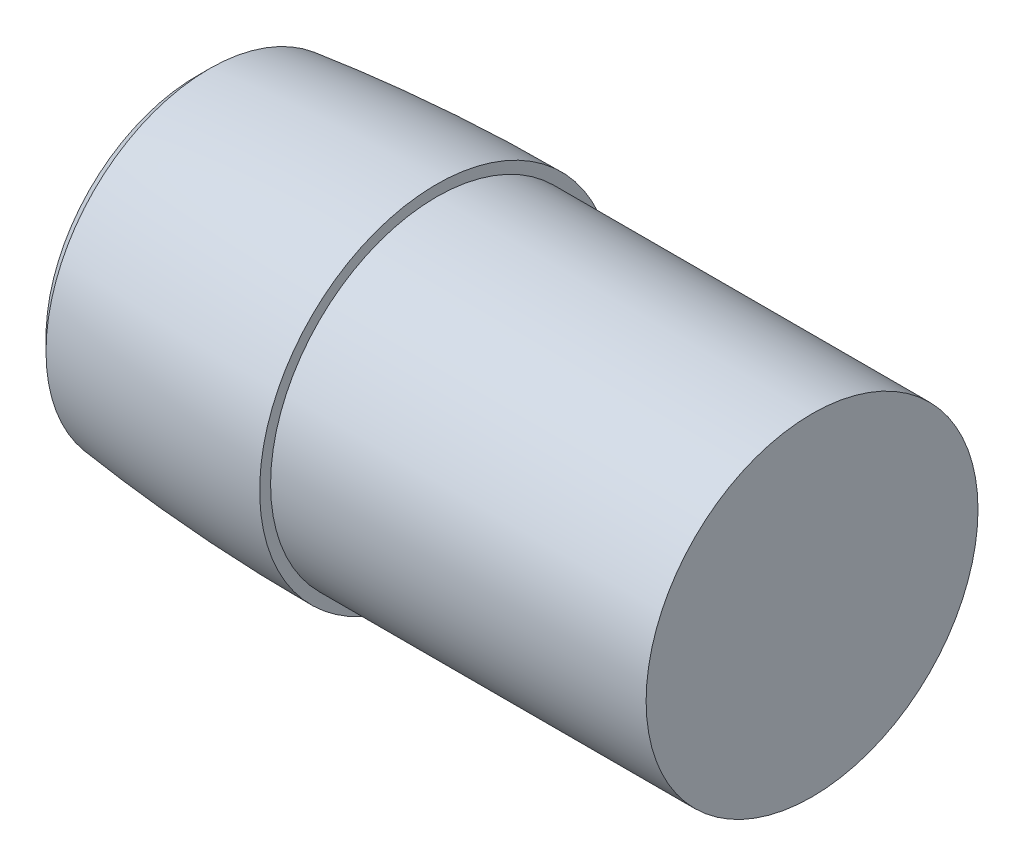
ISO-10303-21;
HEADER;
FILE_DESCRIPTION(('STEP AP214'),'2;1');
FILE_NAME('part.step','',(''),(''),'','','');
FILE_SCHEMA(('AUTOMOTIVE_DESIGN { 1 0 10303 214 1 1 1 1 }'));
ENDSEC;
DATA;
#1=APPLICATION_CONTEXT('core data for automotive mechanical design processes');
#2=APPLICATION_PROTOCOL_DEFINITION('international standard','automotive_design',2000,#1);
#3=PRODUCT_CONTEXT('',#1,'mechanical');
#4=PRODUCT('Part','Part','',(#3));
#5=PRODUCT_RELATED_PRODUCT_CATEGORY('part','',(#4));
#6=PRODUCT_DEFINITION_FORMATION('','',#4);
#7=PRODUCT_DEFINITION_CONTEXT('part definition',#1,'design');
#8=PRODUCT_DEFINITION('design','',#6,#7);
#9=PRODUCT_DEFINITION_SHAPE('','',#8);
#10=(LENGTH_UNIT() NAMED_UNIT(*) SI_UNIT(.MILLI.,.METRE.));
#11=(NAMED_UNIT(*) PLANE_ANGLE_UNIT() SI_UNIT($,.RADIAN.));
#12=(NAMED_UNIT(*) SI_UNIT($,.STERADIAN.) SOLID_ANGLE_UNIT());
#13=UNCERTAINTY_MEASURE_WITH_UNIT(LENGTH_MEASURE(1.E-05),#10,'distance_accuracy_value','');
#14=(GEOMETRIC_REPRESENTATION_CONTEXT(3) GLOBAL_UNCERTAINTY_ASSIGNED_CONTEXT((#13)) GLOBAL_UNIT_ASSIGNED_CONTEXT((#10,
#11,#12)) REPRESENTATION_CONTEXT('',''));
#15=CARTESIAN_POINT('',(0.,0.,0.));
#16=DIRECTION('',(0.,0.,1.));
#17=DIRECTION('',(1.,0.,0.));
#18=AXIS2_PLACEMENT_3D('',#15,#16,#17);
#19=CARTESIAN_POINT('',(-0.0615363027643604,438.738079123923,0.));
#20=DIRECTION('',(-1.,0.,0.));
#21=DIRECTION('',(0.,0.,1.));
#22=AXIS2_PLACEMENT_3D('',#19,#20,#21);
#23=PLANE('',#22);
#24=CARTESIAN_POINT('',(-0.0615363027643978,398.238079123923,0.));
#25=DIRECTION('',(1.,0.,0.));
#26=DIRECTION('',(0.,0.,-1.));
#27=AXIS2_PLACEMENT_3D('',#24,#25,#26);
#28=CIRCLE('',#27,38.);
#29=CARTESIAN_POINT('',(-0.0615363027643978,398.238079123923,-38.));
#30=VERTEX_POINT('',#29);
#31=EDGE_CURVE('E65',#30,#30,#28,.T.);
#32=ORIENTED_EDGE('',*,*,#31,.F.);
#33=EDGE_LOOP('',(#32));
#34=FACE_BOUND('',#33,.T.);
#35=CARTESIAN_POINT('',(-0.0615363027643423,398.238079123923,0.));
#36=DIRECTION('',(1.,0.,0.));
#37=DIRECTION('',(0.,0.,-1.));
#38=AXIS2_PLACEMENT_3D('',#35,#36,#37);
#39=CIRCLE('',#38,40.5);
#40=CARTESIAN_POINT('',(-0.0615363027643423,398.238079123923,-40.5));
#41=VERTEX_POINT('',#40);
#42=EDGE_CURVE('E10',#41,#41,#39,.T.);
#43=ORIENTED_EDGE('',*,*,#42,.T.);
#44=EDGE_LOOP('',(#43));
#45=FACE_BOUND('',#44,.T.);
#46=ADVANCED_FACE('F37',(#34,#45),#23,.F.);
#47=CARTESIAN_POINT('',(0.,398.238079123923,0.));
#48=DIRECTION('',(1.,0.,0.));
#49=DIRECTION('',(0.,0.,-1.));
#50=AXIS2_PLACEMENT_3D('',#47,#48,#49);
#51=DEGENERATE_TOROIDAL_SURFACE('',#50,398.238079123923,438.738083439386,.F.);
#52=CARTESIAN_POINT('',(-52.0944828584497,398.238079123923,0.));
#53=DIRECTION('',(1.,0.,0.));
#54=DIRECTION('',(0.,0.,-1.));
#55=AXIS2_PLACEMENT_3D('',#52,#53,#54);
#56=CIRCLE('',#55,37.3962523006985);
#57=CARTESIAN_POINT('',(-52.0944828584497,398.238079123923,-37.3962523006985));
#58=VERTEX_POINT('',#57);
#59=EDGE_CURVE('E43',#58,#58,#56,.T.);
#60=ORIENTED_EDGE('',*,*,#59,.T.);
#61=EDGE_LOOP('',(#60));
#62=FACE_BOUND('',#61,.T.);
#63=ORIENTED_EDGE('',*,*,#42,.F.);
#64=EDGE_LOOP('',(#63));
#65=FACE_BOUND('',#64,.T.);
#66=ADVANCED_FACE('F72',(#62,#65),#51,.F.);
#67=CARTESIAN_POINT('',(-52.0944828584497,398.238079123923,0.));
#68=DIRECTION('',(1.,0.,0.));
#69=DIRECTION('',(0.,0.,-1.));
#70=AXIS2_PLACEMENT_3D('',#67,#68,#69);
#71=CONICAL_SURFACE('',#70,37.3962523006985,0.785398163397448);
#72=CARTESIAN_POINT('',(-54.9337549348475,398.238079123923,0.));
#73=DIRECTION('',(1.,0.,0.));
#74=DIRECTION('',(0.,0.,-1.));
#75=AXIS2_PLACEMENT_3D('',#72,#73,#74);
#76=CIRCLE('',#75,34.5569802243007);
#77=CARTESIAN_POINT('',(-54.9337549348475,398.238079123923,-34.5569802243007));
#78=VERTEX_POINT('',#77);
#79=EDGE_CURVE('E47',#78,#78,#76,.T.);
#80=ORIENTED_EDGE('',*,*,#79,.T.);
#81=EDGE_LOOP('',(#80));
#82=FACE_BOUND('',#81,.T.);
#83=ORIENTED_EDGE('',*,*,#59,.F.);
#84=EDGE_LOOP('',(#83));
#85=FACE_BOUND('',#84,.T.);
#86=ADVANCED_FACE('F76',(#82,#85),#71,.T.);
#87=CARTESIAN_POINT('',(0.,398.238079123923,0.));
#88=DIRECTION('',(1.,0.,0.));
#89=DIRECTION('',(0.,0.,-1.));
#90=AXIS2_PLACEMENT_3D('',#87,#88,#89);
#91=DEGENERATE_TOROIDAL_SURFACE('',#90,398.238079123923,436.267441860465,.F.);
#92=ORIENTED_EDGE('',*,*,#79,.F.);
#93=EDGE_LOOP('',(#92));
#94=FACE_BOUND('',#93,.T.);
#95=CARTESIAN_POINT('',(-5.0615363027644,398.238079123923,0.));
#96=DIRECTION('',(1.,0.,0.));
#97=DIRECTION('',(0.,0.,-1.));
#98=AXIS2_PLACEMENT_3D('',#95,#96,#97);
#99=CIRCLE('',#98,38.0000000000001);
#100=CARTESIAN_POINT('',(-5.0615363027644,398.238079123923,-38.0000000000001));
#101=VERTEX_POINT('',#100);
#102=EDGE_CURVE('E51',#101,#101,#99,.T.);
#103=ORIENTED_EDGE('',*,*,#102,.T.);
#104=EDGE_LOOP('',(#103));
#105=FACE_BOUND('',#104,.T.);
#106=ADVANCED_FACE('F80',(#94,#105),#91,.T.);
#107=CARTESIAN_POINT('',(-5.0615363027644,436.238079123923,0.));
#108=DIRECTION('',(-1.,0.,0.));
#109=DIRECTION('',(0.,0.,1.));
#110=AXIS2_PLACEMENT_3D('',#107,#108,#109);
#111=PLANE('',#110);
#112=CARTESIAN_POINT('',(-5.06153630276437,398.238079123923,0.));
#113=DIRECTION('',(1.,0.,0.));
#114=DIRECTION('',(0.,0.,-1.));
#115=AXIS2_PLACEMENT_3D('',#112,#113,#114);
#116=CIRCLE('',#115,33.);
#117=CARTESIAN_POINT('',(-5.06153630276437,398.238079123923,-33.));
#118=VERTEX_POINT('',#117);
#119=EDGE_CURVE('E56',#118,#118,#116,.T.);
#120=ORIENTED_EDGE('',*,*,#119,.T.);
#121=EDGE_LOOP('',(#120));
#122=FACE_BOUND('',#121,.T.);
#123=ORIENTED_EDGE('',*,*,#102,.F.);
#124=EDGE_LOOP('',(#123));
#125=FACE_BOUND('',#124,.T.);
#126=ADVANCED_FACE('F87',(#122,#125),#111,.T.);
#127=CARTESIAN_POINT('',(-190.061536302764,398.238079123923,0.));
#128=DIRECTION('',(1.,0.,0.));
#129=DIRECTION('',(0.,0.,-1.));
#130=AXIS2_PLACEMENT_3D('',#127,#128,#129);
#131=CYLINDRICAL_SURFACE('',#130,33.);
#132=CARTESIAN_POINT('',(80.9384636972356,398.238079123923,0.));
#133=DIRECTION('',(1.,0.,0.));
#134=DIRECTION('',(0.,0.,-1.));
#135=AXIS2_PLACEMENT_3D('',#132,#133,#134);
#136=CIRCLE('',#135,33.);
#137=CARTESIAN_POINT('',(80.9384636972356,398.238079123923,-33.));
#138=VERTEX_POINT('',#137);
#139=EDGE_CURVE('E59',#138,#138,#136,.T.);
#140=ORIENTED_EDGE('',*,*,#139,.T.);
#141=EDGE_LOOP('',(#140));
#142=FACE_BOUND('',#141,.T.);
#143=ORIENTED_EDGE('',*,*,#119,.F.);
#144=EDGE_LOOP('',(#143));
#145=FACE_BOUND('',#144,.T.);
#146=ADVANCED_FACE('F91',(#142,#145),#131,.F.);
#147=CARTESIAN_POINT('',(80.9384636972356,398.238079123923,0.));
#148=DIRECTION('',(1.,0.,0.));
#149=DIRECTION('',(0.,0.,-1.));
#150=AXIS2_PLACEMENT_3D('',#147,#148,#149);
#151=PLANE('',#150);
#152=ORIENTED_EDGE('',*,*,#139,.F.);
#153=EDGE_LOOP('',(#152));
#154=FACE_BOUND('',#153,.T.);
#155=ADVANCED_FACE('F95',(#154),#151,.F.);
#156=CARTESIAN_POINT('',(85.9384636972356,436.238079123923,0.));
#157=DIRECTION('',(-1.,0.,0.));
#158=DIRECTION('',(0.,0.,1.));
#159=AXIS2_PLACEMENT_3D('',#156,#157,#158);
#160=PLANE('',#159);
#161=CARTESIAN_POINT('',(85.9384636972356,398.238079123923,0.));
#162=DIRECTION('',(1.,0.,0.));
#163=DIRECTION('',(0.,0.,-1.));
#164=AXIS2_PLACEMENT_3D('',#161,#162,#163);
#165=CIRCLE('',#164,38.);
#166=CARTESIAN_POINT('',(85.9384636972356,398.238079123923,-38.));
#167=VERTEX_POINT('',#166);
#168=EDGE_CURVE('E62',#167,#167,#165,.T.);
#169=ORIENTED_EDGE('',*,*,#168,.T.);
#170=EDGE_LOOP('',(#169));
#171=FACE_BOUND('',#170,.T.);
#172=ADVANCED_FACE('F99',(#171),#160,.F.);
#173=CARTESIAN_POINT('',(-190.061536302764,398.238079123923,0.));
#174=DIRECTION('',(1.,0.,0.));
#175=DIRECTION('',(0.,0.,-1.));
#176=AXIS2_PLACEMENT_3D('',#173,#174,#175);
#177=CYLINDRICAL_SURFACE('',#176,38.);
#178=ORIENTED_EDGE('',*,*,#168,.F.);
#179=EDGE_LOOP('',(#178));
#180=FACE_BOUND('',#179,.T.);
#181=ORIENTED_EDGE('',*,*,#31,.T.);
#182=EDGE_LOOP('',(#181));
#183=FACE_BOUND('',#182,.T.);
#184=ADVANCED_FACE('F69',(#180,#183),#177,.T.);
#185=CLOSED_SHELL('',(#46,#66,#86,#106,#126,#146,#155,#172,#184));
#186=MANIFOLD_SOLID_BREP('B2',#185);
#187=ADVANCED_BREP_SHAPE_REPRESENTATION('',(#18,#186),#14);
#188=SHAPE_DEFINITION_REPRESENTATION(#9,#187);
ENDSEC;
END-ISO-10303-21;
